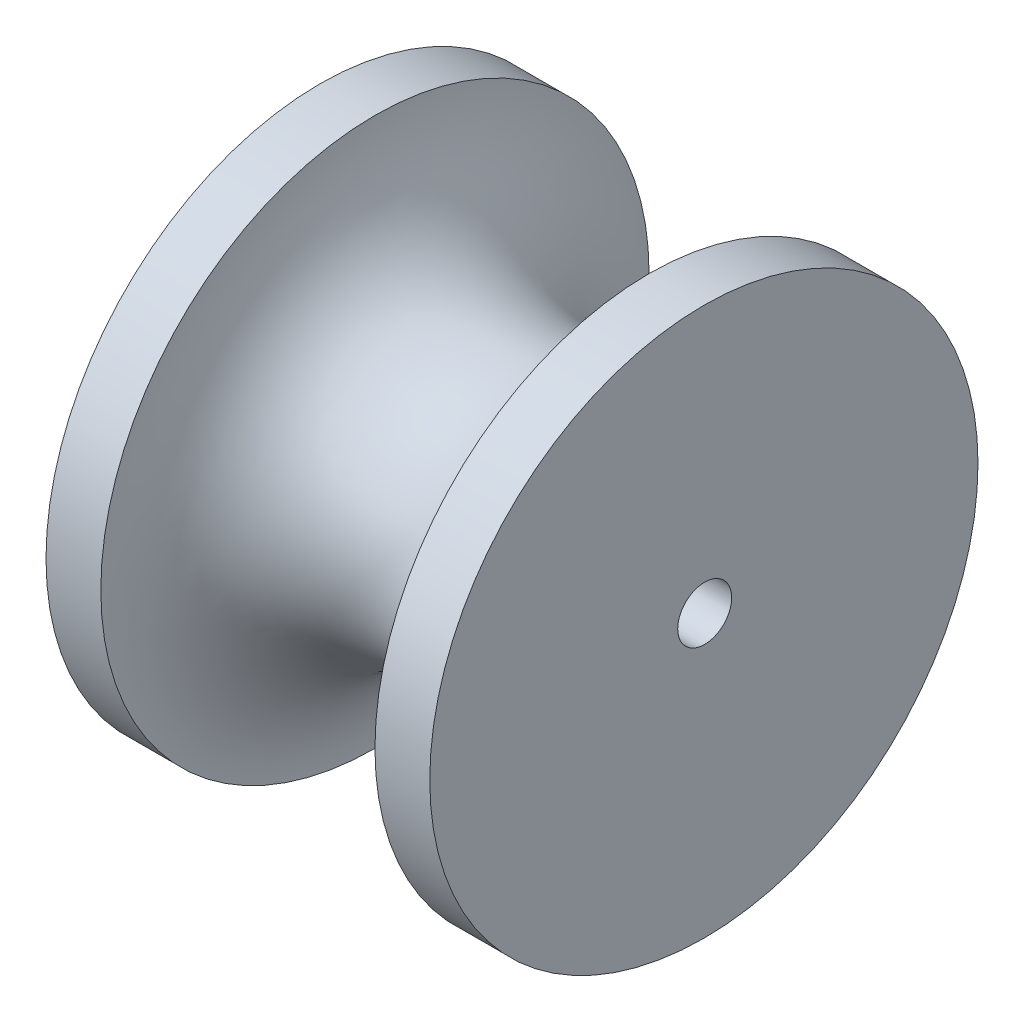
ISO-10303-21;
HEADER;
FILE_DESCRIPTION(('STEP AP214'),'2;1');
FILE_NAME('part.step','',(''),(''),'','','');
FILE_SCHEMA(('AUTOMOTIVE_DESIGN { 1 0 10303 214 1 1 1 1 }'));
ENDSEC;
DATA;
#1=APPLICATION_CONTEXT('core data for automotive mechanical design processes');
#2=APPLICATION_PROTOCOL_DEFINITION('international standard','automotive_design',2000,#1);
#3=PRODUCT_CONTEXT('',#1,'mechanical');
#4=PRODUCT('Part','Part','',(#3));
#5=PRODUCT_RELATED_PRODUCT_CATEGORY('part','',(#4));
#6=PRODUCT_DEFINITION_FORMATION('','',#4);
#7=PRODUCT_DEFINITION_CONTEXT('part definition',#1,'design');
#8=PRODUCT_DEFINITION('design','',#6,#7);
#9=PRODUCT_DEFINITION_SHAPE('','',#8);
#10=(LENGTH_UNIT() NAMED_UNIT(*) SI_UNIT(.MILLI.,.METRE.));
#11=(NAMED_UNIT(*) PLANE_ANGLE_UNIT() SI_UNIT($,.RADIAN.));
#12=(NAMED_UNIT(*) SI_UNIT($,.STERADIAN.) SOLID_ANGLE_UNIT());
#13=UNCERTAINTY_MEASURE_WITH_UNIT(LENGTH_MEASURE(1.E-05),#10,'distance_accuracy_value','');
#14=(GEOMETRIC_REPRESENTATION_CONTEXT(3) GLOBAL_UNCERTAINTY_ASSIGNED_CONTEXT((#13)) GLOBAL_UNIT_ASSIGNED_CONTEXT((#10,
#11,#12)) REPRESENTATION_CONTEXT('',''));
#15=CARTESIAN_POINT('',(0.,0.,0.));
#16=DIRECTION('',(0.,0.,1.));
#17=DIRECTION('',(1.,0.,0.));
#18=AXIS2_PLACEMENT_3D('',#15,#16,#17);
#19=CARTESIAN_POINT('',(-55.7681271354288,-1.93458781362006,0.));
#20=DIRECTION('',(1.,0.,0.));
#21=DIRECTION('',(0.,0.,-1.));
#22=AXIS2_PLACEMENT_3D('',#19,#20,#21);
#23=PLANE('',#22);
#24=CARTESIAN_POINT('',(-55.7681271354288,-26.6865622963541,-0.074929999999987));
#25=DIRECTION('',(-1.,0.,0.));
#26=DIRECTION('',(0.,0.,1.));
#27=AXIS2_PLACEMENT_3D('',#24,#25,#26);
#28=CIRCLE('',#27,2.5);
#29=CARTESIAN_POINT('',(-55.7681271354288,-26.6865622963541,2.42507000000001));
#30=VERTEX_POINT('',#29);
#31=EDGE_CURVE('E53',#30,#30,#28,.T.);
#32=ORIENTED_EDGE('',*,*,#31,.F.);
#33=EDGE_LOOP('',(#32));
#34=FACE_BOUND('',#33,.T.);
#35=CARTESIAN_POINT('',(-55.7681271354288,-27.3345878136201,0.));
#36=DIRECTION('',(-1.,0.,0.));
#37=DIRECTION('',(0.,0.,1.));
#38=AXIS2_PLACEMENT_3D('',#35,#36,#37);
#39=CIRCLE('',#38,25.4);
#40=CARTESIAN_POINT('',(-55.7681271354288,-27.3345878136201,25.4));
#41=VERTEX_POINT('',#40);
#42=EDGE_CURVE('E47',#41,#41,#39,.T.);
#43=ORIENTED_EDGE('',*,*,#42,.T.);
#44=EDGE_LOOP('',(#43));
#45=FACE_BOUND('',#44,.T.);
#46=ADVANCED_FACE('F33',(#34,#45),#23,.F.);
#47=CARTESIAN_POINT('',(-20.2081271354288,-27.3345878136201,0.));
#48=DIRECTION('',(-1.,0.,0.));
#49=DIRECTION('',(0.,0.,1.));
#50=AXIS2_PLACEMENT_3D('',#47,#48,#49);
#51=PLANE('',#50);
#52=CARTESIAN_POINT('',(-20.2081271354288,-26.6865622963541,-0.074929999999987));
#53=DIRECTION('',(-1.,0.,0.));
#54=DIRECTION('',(0.,0.,1.));
#55=AXIS2_PLACEMENT_3D('',#52,#53,#54);
#56=CIRCLE('',#55,2.5);
#57=CARTESIAN_POINT('',(-20.2081271354288,-26.6865622963541,2.42507000000001));
#58=VERTEX_POINT('',#57);
#59=EDGE_CURVE('E52',#58,#58,#56,.T.);
#60=ORIENTED_EDGE('',*,*,#59,.T.);
#61=EDGE_LOOP('',(#60));
#62=FACE_BOUND('',#61,.T.);
#63=CARTESIAN_POINT('',(-20.2081271354288,-27.3345878136201,0.));
#64=DIRECTION('',(-1.,0.,0.));
#65=DIRECTION('',(0.,0.,1.));
#66=AXIS2_PLACEMENT_3D('',#63,#64,#65);
#67=CIRCLE('',#66,25.4);
#68=CARTESIAN_POINT('',(-20.2081271354288,-27.3345878136201,25.4));
#69=VERTEX_POINT('',#68);
#70=EDGE_CURVE('E10',#69,#69,#67,.T.);
#71=ORIENTED_EDGE('',*,*,#70,.F.);
#72=EDGE_LOOP('',(#71));
#73=FACE_BOUND('',#72,.T.);
#74=ADVANCED_FACE('F59',(#62,#73),#51,.F.);
#75=CARTESIAN_POINT('',(-55.7681271354288,-27.3345878136201,0.));
#76=DIRECTION('',(-1.,0.,0.));
#77=DIRECTION('',(0.,0.,1.));
#78=AXIS2_PLACEMENT_3D('',#75,#76,#77);
#79=CYLINDRICAL_SURFACE('',#78,25.4);
#80=CARTESIAN_POINT('',(-25.2881271354288,-27.3345878136201,0.));
#81=DIRECTION('',(-1.,0.,0.));
#82=DIRECTION('',(0.,0.,1.));
#83=AXIS2_PLACEMENT_3D('',#80,#81,#82);
#84=CIRCLE('',#83,25.4);
#85=CARTESIAN_POINT('',(-25.2881271354288,-27.3345878136201,25.4));
#86=VERTEX_POINT('',#85);
#87=EDGE_CURVE('E39',#86,#86,#84,.T.);
#88=ORIENTED_EDGE('',*,*,#87,.F.);
#89=EDGE_LOOP('',(#88));
#90=FACE_BOUND('',#89,.T.);
#91=ORIENTED_EDGE('',*,*,#70,.T.);
#92=EDGE_LOOP('',(#91));
#93=FACE_BOUND('',#92,.T.);
#94=ADVANCED_FACE('F80',(#90,#93),#79,.T.);
#95=CARTESIAN_POINT('',(-37.9881271354288,-27.3345878136201,0.));
#96=DIRECTION('',(-1.,0.,0.));
#97=DIRECTION('',(0.,0.,1.));
#98=AXIS2_PLACEMENT_3D('',#95,#96,#97);
#99=TOROIDAL_SURFACE('',#98,25.4,12.7);
#100=CARTESIAN_POINT('',(-50.6881271354288,-27.3345878136201,0.));
#101=DIRECTION('',(-1.,0.,0.));
#102=DIRECTION('',(0.,0.,1.));
#103=AXIS2_PLACEMENT_3D('',#100,#101,#102);
#104=CIRCLE('',#103,25.4);
#105=CARTESIAN_POINT('',(-50.6881271354288,-27.3345878136201,25.4));
#106=VERTEX_POINT('',#105);
#107=EDGE_CURVE('E43',#106,#106,#104,.T.);
#108=ORIENTED_EDGE('',*,*,#107,.F.);
#109=EDGE_LOOP('',(#108));
#110=FACE_BOUND('',#109,.T.);
#111=ORIENTED_EDGE('',*,*,#87,.T.);
#112=EDGE_LOOP('',(#111));
#113=FACE_BOUND('',#112,.T.);
#114=ADVANCED_FACE('F75',(#110,#113),#99,.F.);
#115=CARTESIAN_POINT('',(-55.7681271354288,-27.3345878136201,0.));
#116=DIRECTION('',(-1.,0.,0.));
#117=DIRECTION('',(0.,0.,1.));
#118=AXIS2_PLACEMENT_3D('',#115,#116,#117);
#119=CYLINDRICAL_SURFACE('',#118,25.4);
#120=ORIENTED_EDGE('',*,*,#42,.F.);
#121=EDGE_LOOP('',(#120));
#122=FACE_BOUND('',#121,.T.);
#123=ORIENTED_EDGE('',*,*,#107,.T.);
#124=EDGE_LOOP('',(#123));
#125=FACE_BOUND('',#124,.T.);
#126=ADVANCED_FACE('F65',(#122,#125),#119,.T.);
#127=CARTESIAN_POINT('',(-20.2081271354288,-26.6865622963541,-0.074929999999987));
#128=DIRECTION('',(-1.,0.,0.));
#129=DIRECTION('',(0.,0.,1.));
#130=AXIS2_PLACEMENT_3D('',#127,#128,#129);
#131=CYLINDRICAL_SURFACE('',#130,2.5);
#132=ORIENTED_EDGE('',*,*,#59,.F.);
#133=EDGE_LOOP('',(#132));
#134=FACE_BOUND('',#133,.T.);
#135=ORIENTED_EDGE('',*,*,#31,.T.);
#136=EDGE_LOOP('',(#135));
#137=FACE_BOUND('',#136,.T.);
#138=ADVANCED_FACE('F62',(#134,#137),#131,.F.);
#139=CLOSED_SHELL('',(#46,#74,#94,#114,#126,#138));
#140=MANIFOLD_SOLID_BREP('B2',#139);
#141=ADVANCED_BREP_SHAPE_REPRESENTATION('',(#18,#140),#14);
#142=SHAPE_DEFINITION_REPRESENTATION(#9,#141);
ENDSEC;
END-ISO-10303-21;
